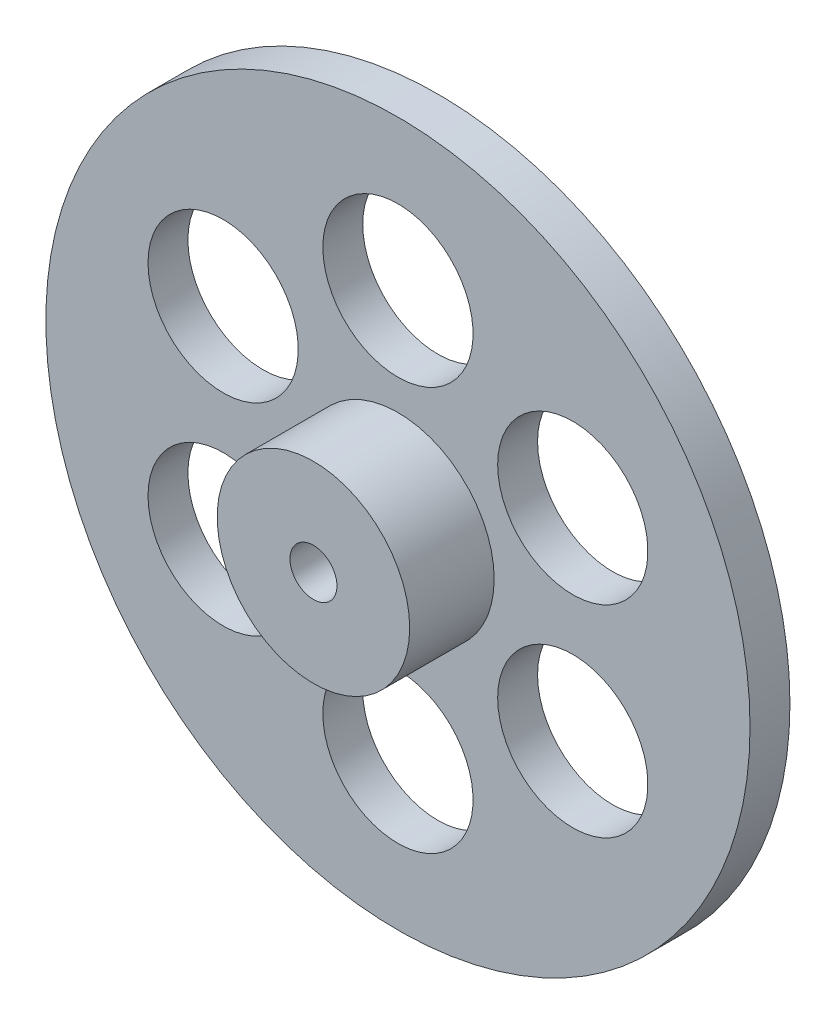
ISO-10303-21;
HEADER;
FILE_DESCRIPTION(('STEP AP214'),'2;1');
FILE_NAME('part.step','',(''),(''),'','','');
FILE_SCHEMA(('AUTOMOTIVE_DESIGN { 1 0 10303 214 1 1 1 1 }'));
ENDSEC;
DATA;
#1=APPLICATION_CONTEXT('core data for automotive mechanical design processes');
#2=APPLICATION_PROTOCOL_DEFINITION('international standard','automotive_design',2000,#1);
#3=PRODUCT_CONTEXT('',#1,'mechanical');
#4=PRODUCT('Part','Part','',(#3));
#5=PRODUCT_RELATED_PRODUCT_CATEGORY('part','',(#4));
#6=PRODUCT_DEFINITION_FORMATION('','',#4);
#7=PRODUCT_DEFINITION_CONTEXT('part definition',#1,'design');
#8=PRODUCT_DEFINITION('design','',#6,#7);
#9=PRODUCT_DEFINITION_SHAPE('','',#8);
#10=(LENGTH_UNIT() NAMED_UNIT(*) SI_UNIT(.MILLI.,.METRE.));
#11=(NAMED_UNIT(*) PLANE_ANGLE_UNIT() SI_UNIT($,.RADIAN.));
#12=(NAMED_UNIT(*) SI_UNIT($,.STERADIAN.) SOLID_ANGLE_UNIT());
#13=UNCERTAINTY_MEASURE_WITH_UNIT(LENGTH_MEASURE(1.E-05),#10,'distance_accuracy_value','');
#14=(GEOMETRIC_REPRESENTATION_CONTEXT(3) GLOBAL_UNCERTAINTY_ASSIGNED_CONTEXT((#13)) GLOBAL_UNIT_ASSIGNED_CONTEXT((#10,
#11,#12)) REPRESENTATION_CONTEXT('',''));
#15=CARTESIAN_POINT('',(0.,0.,0.));
#16=DIRECTION('',(0.,0.,1.));
#17=DIRECTION('',(1.,0.,0.));
#18=AXIS2_PLACEMENT_3D('',#15,#16,#17);
#19=CARTESIAN_POINT('',(0.,7.5,-2.65));
#20=DIRECTION('',(0.,0.,1.));
#21=DIRECTION('',(1.,0.,0.));
#22=AXIS2_PLACEMENT_3D('',#19,#20,#21);
#23=PLANE('',#22);
#24=CARTESIAN_POINT('',(-3.72390923627306,2.15000000000004,-2.65));
#25=DIRECTION('',(0.,0.,-1.));
#26=DIRECTION('',(-0.50000000000001,-0.866025403784433,0.));
#27=AXIS2_PLACEMENT_3D('',#24,#25,#26);
#28=CIRCLE('',#27,1.6);
#29=CARTESIAN_POINT('',(-4.52390923627308,0.764359353944951,-2.65));
#30=VERTEX_POINT('',#29);
#31=EDGE_CURVE('E172',#30,#30,#28,.T.);
#32=ORIENTED_EDGE('',*,*,#31,.F.);
#33=EDGE_LOOP('',(#32));
#34=FACE_BOUND('',#33,.T.);
#35=CARTESIAN_POINT('',(-3.72390923627311,-2.14999999999997,-2.65));
#36=DIRECTION('',(0.,0.,-1.));
#37=DIRECTION('',(0.499999999999992,-0.866025403784443,0.));
#38=AXIS2_PLACEMENT_3D('',#35,#36,#37);
#39=CIRCLE('',#38,1.6);
#40=CARTESIAN_POINT('',(-2.92390923627312,-3.53564064605507,-2.65));
#41=VERTEX_POINT('',#40);
#42=EDGE_CURVE('E168',#41,#41,#39,.T.);
#43=ORIENTED_EDGE('',*,*,#42,.F.);
#44=EDGE_LOOP('',(#43));
#45=FACE_BOUND('',#44,.T.);
#46=CARTESIAN_POINT('',(0.,-4.3,-2.65));
#47=DIRECTION('',(0.,0.,-1.));
#48=DIRECTION('',(1.,0.,0.));
#49=AXIS2_PLACEMENT_3D('',#46,#47,#48);
#50=CIRCLE('',#49,1.6);
#51=CARTESIAN_POINT('',(1.6,-4.3,-2.65));
#52=VERTEX_POINT('',#51);
#53=EDGE_CURVE('E164',#52,#52,#50,.T.);
#54=ORIENTED_EDGE('',*,*,#53,.F.);
#55=EDGE_LOOP('',(#54));
#56=FACE_BOUND('',#55,.T.);
#57=CARTESIAN_POINT('',(3.72390923627308,-2.15000000000002,-2.65));
#58=DIRECTION('',(0.,0.,-1.));
#59=DIRECTION('',(0.500000000000004,0.866025403784436,0.));
#60=AXIS2_PLACEMENT_3D('',#57,#58,#59);
#61=CIRCLE('',#60,1.6);
#62=CARTESIAN_POINT('',(4.52390923627308,-0.764359353944919,-2.65));
#63=VERTEX_POINT('',#62);
#64=EDGE_CURVE('E154',#63,#63,#61,.T.);
#65=ORIENTED_EDGE('',*,*,#64,.F.);
#66=EDGE_LOOP('',(#65));
#67=FACE_BOUND('',#66,.T.);
#68=CARTESIAN_POINT('',(3.72390923627309,2.14999999999999,-2.65));
#69=DIRECTION('',(0.,0.,-1.));
#70=DIRECTION('',(-0.499999999999998,0.86602540378444,0.));
#71=AXIS2_PLACEMENT_3D('',#68,#69,#70);
#72=CIRCLE('',#71,1.6);
#73=CARTESIAN_POINT('',(2.92390923627309,3.5356406460551,-2.65));
#74=VERTEX_POINT('',#73);
#75=EDGE_CURVE('E56',#74,#74,#72,.T.);
#76=ORIENTED_EDGE('',*,*,#75,.F.);
#77=EDGE_LOOP('',(#76));
#78=FACE_BOUND('',#77,.T.);
#79=CARTESIAN_POINT('',(0.,4.3,-2.65));
#80=DIRECTION('',(0.,0.,-1.));
#81=DIRECTION('',(-1.,0.,0.));
#82=AXIS2_PLACEMENT_3D('',#79,#80,#81);
#83=CIRCLE('',#82,1.6);
#84=CARTESIAN_POINT('',(-1.6,4.3,-2.65));
#85=VERTEX_POINT('',#84);
#86=EDGE_CURVE('E51',#85,#85,#83,.T.);
#87=ORIENTED_EDGE('',*,*,#86,.F.);
#88=EDGE_LOOP('',(#87));
#89=FACE_BOUND('',#88,.T.);
#90=CARTESIAN_POINT('',(0.,0.,-2.65000000000001));
#91=DIRECTION('',(0.,0.,1.));
#92=DIRECTION('',(1.,0.,0.));
#93=AXIS2_PLACEMENT_3D('',#90,#91,#92);
#94=CIRCLE('',#93,7.5);
#95=CARTESIAN_POINT('',(7.5,0.,-2.65000000000001));
#96=VERTEX_POINT('',#95);
#97=EDGE_CURVE('E10',#96,#96,#94,.T.);
#98=ORIENTED_EDGE('',*,*,#97,.F.);
#99=EDGE_LOOP('',(#98));
#100=FACE_BOUND('',#99,.T.);
#101=CARTESIAN_POINT('',(0.,0.,-2.65000000000001));
#102=DIRECTION('',(0.,0.,1.));
#103=DIRECTION('',(1.,0.,0.));
#104=AXIS2_PLACEMENT_3D('',#101,#102,#103);
#105=CIRCLE('',#104,1.5);
#106=CARTESIAN_POINT('',(1.5,0.,-2.65000000000001));
#107=VERTEX_POINT('',#106);
#108=EDGE_CURVE('E50',#107,#107,#105,.T.);
#109=ORIENTED_EDGE('',*,*,#108,.T.);
#110=EDGE_LOOP('',(#109));
#111=FACE_BOUND('',#110,.T.);
#112=ADVANCED_FACE('F31',(#34,#45,#56,#67,#78,#89,#100,#111),#23,.F.);
#113=CARTESIAN_POINT('',(0.,0.,128.69830851466));
#114=DIRECTION('',(0.,0.,1.));
#115=DIRECTION('',(1.,0.,0.));
#116=AXIS2_PLACEMENT_3D('',#113,#114,#115);
#117=CYLINDRICAL_SURFACE('',#116,7.5);
#118=CARTESIAN_POINT('',(0.,0.,-1.8));
#119=DIRECTION('',(0.,0.,1.));
#120=DIRECTION('',(1.,0.,0.));
#121=AXIS2_PLACEMENT_3D('',#118,#119,#120);
#122=CIRCLE('',#121,7.5);
#123=CARTESIAN_POINT('',(7.5,0.,-1.8));
#124=VERTEX_POINT('',#123);
#125=EDGE_CURVE('E38',#124,#124,#122,.T.);
#126=ORIENTED_EDGE('',*,*,#125,.F.);
#127=EDGE_LOOP('',(#126));
#128=FACE_BOUND('',#127,.T.);
#129=ORIENTED_EDGE('',*,*,#97,.T.);
#130=EDGE_LOOP('',(#129));
#131=FACE_BOUND('',#130,.T.);
#132=ADVANCED_FACE('F96',(#128,#131),#117,.T.);
#133=CARTESIAN_POINT('',(0.,2.05,-1.8));
#134=DIRECTION('',(0.,0.,-1.));
#135=DIRECTION('',(-1.,0.,0.));
#136=AXIS2_PLACEMENT_3D('',#133,#134,#135);
#137=PLANE('',#136);
#138=CARTESIAN_POINT('',(-3.72390923627306,2.15000000000004,-1.8));
#139=DIRECTION('',(0.,0.,-1.));
#140=DIRECTION('',(-1.,0.,0.));
#141=AXIS2_PLACEMENT_3D('',#138,#139,#140);
#142=CIRCLE('',#141,1.6);
#143=CARTESIAN_POINT('',(-5.32390923627306,2.15000000000004,-1.8));
#144=VERTEX_POINT('',#143);
#145=EDGE_CURVE('E34',#144,#144,#142,.T.);
#146=ORIENTED_EDGE('',*,*,#145,.T.);
#147=EDGE_LOOP('',(#146));
#148=FACE_BOUND('',#147,.T.);
#149=CARTESIAN_POINT('',(-3.72390923627311,-2.14999999999997,-1.8));
#150=DIRECTION('',(0.,0.,-1.));
#151=DIRECTION('',(-1.,0.,0.));
#152=AXIS2_PLACEMENT_3D('',#149,#150,#151);
#153=CIRCLE('',#152,1.6);
#154=CARTESIAN_POINT('',(-5.32390923627311,-2.14999999999997,-1.8));
#155=VERTEX_POINT('',#154);
#156=EDGE_CURVE('E61',#155,#155,#153,.T.);
#157=ORIENTED_EDGE('',*,*,#156,.T.);
#158=EDGE_LOOP('',(#157));
#159=FACE_BOUND('',#158,.T.);
#160=CARTESIAN_POINT('',(0.,-4.3,-1.8));
#161=DIRECTION('',(0.,0.,-1.));
#162=DIRECTION('',(-1.,0.,0.));
#163=AXIS2_PLACEMENT_3D('',#160,#161,#162);
#164=CIRCLE('',#163,1.6);
#165=CARTESIAN_POINT('',(-1.6,-4.3,-1.8));
#166=VERTEX_POINT('',#165);
#167=EDGE_CURVE('E59',#166,#166,#164,.T.);
#168=ORIENTED_EDGE('',*,*,#167,.T.);
#169=EDGE_LOOP('',(#168));
#170=FACE_BOUND('',#169,.T.);
#171=CARTESIAN_POINT('',(3.72390923627308,-2.15000000000002,-1.8));
#172=DIRECTION('',(0.,0.,-1.));
#173=DIRECTION('',(-1.,0.,0.));
#174=AXIS2_PLACEMENT_3D('',#171,#172,#173);
#175=CIRCLE('',#174,1.6);
#176=CARTESIAN_POINT('',(2.12390923627308,-2.15000000000002,-1.8));
#177=VERTEX_POINT('',#176);
#178=EDGE_CURVE('E55',#177,#177,#175,.T.);
#179=ORIENTED_EDGE('',*,*,#178,.T.);
#180=EDGE_LOOP('',(#179));
#181=FACE_BOUND('',#180,.T.);
#182=CARTESIAN_POINT('',(3.72390923627309,2.14999999999999,-1.8));
#183=DIRECTION('',(0.,0.,-1.));
#184=DIRECTION('',(-1.,0.,0.));
#185=AXIS2_PLACEMENT_3D('',#182,#183,#184);
#186=CIRCLE('',#185,1.6);
#187=CARTESIAN_POINT('',(2.12390923627309,2.14999999999999,-1.8));
#188=VERTEX_POINT('',#187);
#189=EDGE_CURVE('E52',#188,#188,#186,.T.);
#190=ORIENTED_EDGE('',*,*,#189,.T.);
#191=EDGE_LOOP('',(#190));
#192=FACE_BOUND('',#191,.T.);
#193=CARTESIAN_POINT('',(0.,4.3,-1.8));
#194=DIRECTION('',(0.,0.,-1.));
#195=DIRECTION('',(-1.,0.,0.));
#196=AXIS2_PLACEMENT_3D('',#193,#194,#195);
#197=CIRCLE('',#196,1.6);
#198=CARTESIAN_POINT('',(-1.6,4.3,-1.8));
#199=VERTEX_POINT('',#198);
#200=EDGE_CURVE('E47',#199,#199,#197,.T.);
#201=ORIENTED_EDGE('',*,*,#200,.T.);
#202=EDGE_LOOP('',(#201));
#203=FACE_BOUND('',#202,.T.);
#204=CARTESIAN_POINT('',(0.,0.,-1.8));
#205=DIRECTION('',(0.,0.,1.));
#206=DIRECTION('',(1.,0.,0.));
#207=AXIS2_PLACEMENT_3D('',#204,#205,#206);
#208=CIRCLE('',#207,2.05);
#209=CARTESIAN_POINT('',(2.05,0.,-1.8));
#210=VERTEX_POINT('',#209);
#211=EDGE_CURVE('E43',#210,#210,#208,.T.);
#212=ORIENTED_EDGE('',*,*,#211,.F.);
#213=EDGE_LOOP('',(#212));
#214=FACE_BOUND('',#213,.T.);
#215=ORIENTED_EDGE('',*,*,#125,.T.);
#216=EDGE_LOOP('',(#215));
#217=FACE_BOUND('',#216,.T.);
#218=ADVANCED_FACE('F93',(#148,#159,#170,#181,#192,#203,#214,#217),#137,.F.);
#219=CARTESIAN_POINT('',(0.,0.,128.69830851466));
#220=DIRECTION('',(0.,0.,1.));
#221=DIRECTION('',(1.,0.,0.));
#222=AXIS2_PLACEMENT_3D('',#219,#220,#221);
#223=CYLINDRICAL_SURFACE('',#222,2.05);
#224=CARTESIAN_POINT('',(0.,0.,0.));
#225=DIRECTION('',(0.,0.,1.));
#226=DIRECTION('',(1.,0.,0.));
#227=AXIS2_PLACEMENT_3D('',#224,#225,#226);
#228=CIRCLE('',#227,2.05);
#229=CARTESIAN_POINT('',(2.05,0.,0.));
#230=VERTEX_POINT('',#229);
#231=EDGE_CURVE('E86',#230,#230,#228,.T.);
#232=ORIENTED_EDGE('',*,*,#231,.F.);
#233=EDGE_LOOP('',(#232));
#234=FACE_BOUND('',#233,.T.);
#235=ORIENTED_EDGE('',*,*,#211,.T.);
#236=EDGE_LOOP('',(#235));
#237=FACE_BOUND('',#236,.T.);
#238=ADVANCED_FACE('F91',(#234,#237),#223,.T.);
#239=CARTESIAN_POINT('',(0.,0.5,0.));
#240=DIRECTION('',(0.,0.,-1.));
#241=DIRECTION('',(-1.,0.,0.));
#242=AXIS2_PLACEMENT_3D('',#239,#240,#241);
#243=PLANE('',#242);
#244=CARTESIAN_POINT('',(0.,0.,0.));
#245=DIRECTION('',(0.,0.,1.));
#246=DIRECTION('',(1.,0.,0.));
#247=AXIS2_PLACEMENT_3D('',#244,#245,#246);
#248=CIRCLE('',#247,0.5);
#249=CARTESIAN_POINT('',(0.5,0.,0.));
#250=VERTEX_POINT('',#249);
#251=EDGE_CURVE('E83',#250,#250,#248,.T.);
#252=ORIENTED_EDGE('',*,*,#251,.F.);
#253=EDGE_LOOP('',(#252));
#254=FACE_BOUND('',#253,.T.);
#255=ORIENTED_EDGE('',*,*,#231,.T.);
#256=EDGE_LOOP('',(#255));
#257=FACE_BOUND('',#256,.T.);
#258=ADVANCED_FACE('F110',(#254,#257),#243,.F.);
#259=CARTESIAN_POINT('',(0.,0.,128.69830851466));
#260=DIRECTION('',(0.,0.,1.));
#261=DIRECTION('',(1.,0.,0.));
#262=AXIS2_PLACEMENT_3D('',#259,#260,#261);
#263=CYLINDRICAL_SURFACE('',#262,0.5);
#264=CARTESIAN_POINT('',(0.,0.,-3.));
#265=DIRECTION('',(0.,0.,1.));
#266=DIRECTION('',(1.,0.,0.));
#267=AXIS2_PLACEMENT_3D('',#264,#265,#266);
#268=CIRCLE('',#267,0.5);
#269=CARTESIAN_POINT('',(0.5,0.,-3.));
#270=VERTEX_POINT('',#269);
#271=EDGE_CURVE('E80',#270,#270,#268,.T.);
#272=ORIENTED_EDGE('',*,*,#271,.F.);
#273=EDGE_LOOP('',(#272));
#274=FACE_BOUND('',#273,.T.);
#275=ORIENTED_EDGE('',*,*,#251,.T.);
#276=EDGE_LOOP('',(#275));
#277=FACE_BOUND('',#276,.T.);
#278=ADVANCED_FACE('F114',(#274,#277),#263,.F.);
#279=CARTESIAN_POINT('',(0.,1.5,-3.));
#280=DIRECTION('',(0.,0.,1.));
#281=DIRECTION('',(1.,0.,0.));
#282=AXIS2_PLACEMENT_3D('',#279,#280,#281);
#283=PLANE('',#282);
#284=CARTESIAN_POINT('',(0.,0.,-3.));
#285=DIRECTION('',(0.,0.,1.));
#286=DIRECTION('',(1.,0.,0.));
#287=AXIS2_PLACEMENT_3D('',#284,#285,#286);
#288=CIRCLE('',#287,1.5);
#289=CARTESIAN_POINT('',(1.5,0.,-3.));
#290=VERTEX_POINT('',#289);
#291=EDGE_CURVE('E77',#290,#290,#288,.T.);
#292=ORIENTED_EDGE('',*,*,#291,.F.);
#293=EDGE_LOOP('',(#292));
#294=FACE_BOUND('',#293,.T.);
#295=ORIENTED_EDGE('',*,*,#271,.T.);
#296=EDGE_LOOP('',(#295));
#297=FACE_BOUND('',#296,.T.);
#298=ADVANCED_FACE('F118',(#294,#297),#283,.F.);
#299=CARTESIAN_POINT('',(0.,0.,128.69830851466));
#300=DIRECTION('',(0.,0.,1.));
#301=DIRECTION('',(1.,0.,0.));
#302=AXIS2_PLACEMENT_3D('',#299,#300,#301);
#303=CYLINDRICAL_SURFACE('',#302,1.5);
#304=ORIENTED_EDGE('',*,*,#108,.F.);
#305=EDGE_LOOP('',(#304));
#306=FACE_BOUND('',#305,.T.);
#307=ORIENTED_EDGE('',*,*,#291,.T.);
#308=EDGE_LOOP('',(#307));
#309=FACE_BOUND('',#308,.T.);
#310=ADVANCED_FACE('F122',(#306,#309),#303,.T.);
#311=CARTESIAN_POINT('',(0.,4.3,0.));
#312=DIRECTION('',(0.,0.,-1.));
#313=DIRECTION('',(-1.,0.,0.));
#314=AXIS2_PLACEMENT_3D('',#311,#312,#313);
#315=CYLINDRICAL_SURFACE('',#314,1.6);
#316=ORIENTED_EDGE('',*,*,#86,.T.);
#317=EDGE_LOOP('',(#316));
#318=FACE_BOUND('',#317,.T.);
#319=ORIENTED_EDGE('',*,*,#200,.F.);
#320=EDGE_LOOP('',(#319));
#321=FACE_BOUND('',#320,.T.);
#322=ADVANCED_FACE('F126',(#318,#321),#315,.F.);
#323=CARTESIAN_POINT('',(3.72390923627309,2.14999999999999,0.));
#324=DIRECTION('',(0.,0.,-1.));
#325=DIRECTION('',(-1.,0.,0.));
#326=AXIS2_PLACEMENT_3D('',#323,#324,#325);
#327=CYLINDRICAL_SURFACE('',#326,1.6);
#328=ORIENTED_EDGE('',*,*,#75,.T.);
#329=EDGE_LOOP('',(#328));
#330=FACE_BOUND('',#329,.T.);
#331=ORIENTED_EDGE('',*,*,#189,.F.);
#332=EDGE_LOOP('',(#331));
#333=FACE_BOUND('',#332,.T.);
#334=ADVANCED_FACE('F130',(#330,#333),#327,.F.);
#335=CARTESIAN_POINT('',(3.72390923627308,-2.15000000000002,0.));
#336=DIRECTION('',(0.,0.,-1.));
#337=DIRECTION('',(-1.,0.,0.));
#338=AXIS2_PLACEMENT_3D('',#335,#336,#337);
#339=CYLINDRICAL_SURFACE('',#338,1.6);
#340=ORIENTED_EDGE('',*,*,#64,.T.);
#341=EDGE_LOOP('',(#340));
#342=FACE_BOUND('',#341,.T.);
#343=ORIENTED_EDGE('',*,*,#178,.F.);
#344=EDGE_LOOP('',(#343));
#345=FACE_BOUND('',#344,.T.);
#346=ADVANCED_FACE('F133',(#342,#345),#339,.F.);
#347=CARTESIAN_POINT('',(0.,-4.3,0.));
#348=DIRECTION('',(0.,0.,-1.));
#349=DIRECTION('',(-1.,0.,0.));
#350=AXIS2_PLACEMENT_3D('',#347,#348,#349);
#351=CYLINDRICAL_SURFACE('',#350,1.6);
#352=ORIENTED_EDGE('',*,*,#53,.T.);
#353=EDGE_LOOP('',(#352));
#354=FACE_BOUND('',#353,.T.);
#355=ORIENTED_EDGE('',*,*,#167,.F.);
#356=EDGE_LOOP('',(#355));
#357=FACE_BOUND('',#356,.T.);
#358=ADVANCED_FACE('F142',(#354,#357),#351,.F.);
#359=CARTESIAN_POINT('',(-3.72390923627311,-2.14999999999997,0.));
#360=DIRECTION('',(0.,0.,-1.));
#361=DIRECTION('',(-1.,0.,0.));
#362=AXIS2_PLACEMENT_3D('',#359,#360,#361);
#363=CYLINDRICAL_SURFACE('',#362,1.6);
#364=ORIENTED_EDGE('',*,*,#42,.T.);
#365=EDGE_LOOP('',(#364));
#366=FACE_BOUND('',#365,.T.);
#367=ORIENTED_EDGE('',*,*,#156,.F.);
#368=EDGE_LOOP('',(#367));
#369=FACE_BOUND('',#368,.T.);
#370=ADVANCED_FACE('F138',(#366,#369),#363,.F.);
#371=CARTESIAN_POINT('',(-3.72390923627306,2.15000000000004,0.));
#372=DIRECTION('',(0.,0.,-1.));
#373=DIRECTION('',(-1.,0.,0.));
#374=AXIS2_PLACEMENT_3D('',#371,#372,#373);
#375=CYLINDRICAL_SURFACE('',#374,1.6);
#376=ORIENTED_EDGE('',*,*,#31,.T.);
#377=EDGE_LOOP('',(#376));
#378=FACE_BOUND('',#377,.T.);
#379=ORIENTED_EDGE('',*,*,#145,.F.);
#380=EDGE_LOOP('',(#379));
#381=FACE_BOUND('',#380,.T.);
#382=ADVANCED_FACE('F135',(#378,#381),#375,.F.);
#383=CLOSED_SHELL('',(#112,#132,#218,#238,#258,#278,#298,#310,#322,#334,#346,#358,#370,#382));
#384=MANIFOLD_SOLID_BREP('B2',#383);
#385=ADVANCED_BREP_SHAPE_REPRESENTATION('',(#18,#384),#14);
#386=SHAPE_DEFINITION_REPRESENTATION(#9,#385);
ENDSEC;
END-ISO-10303-21;
